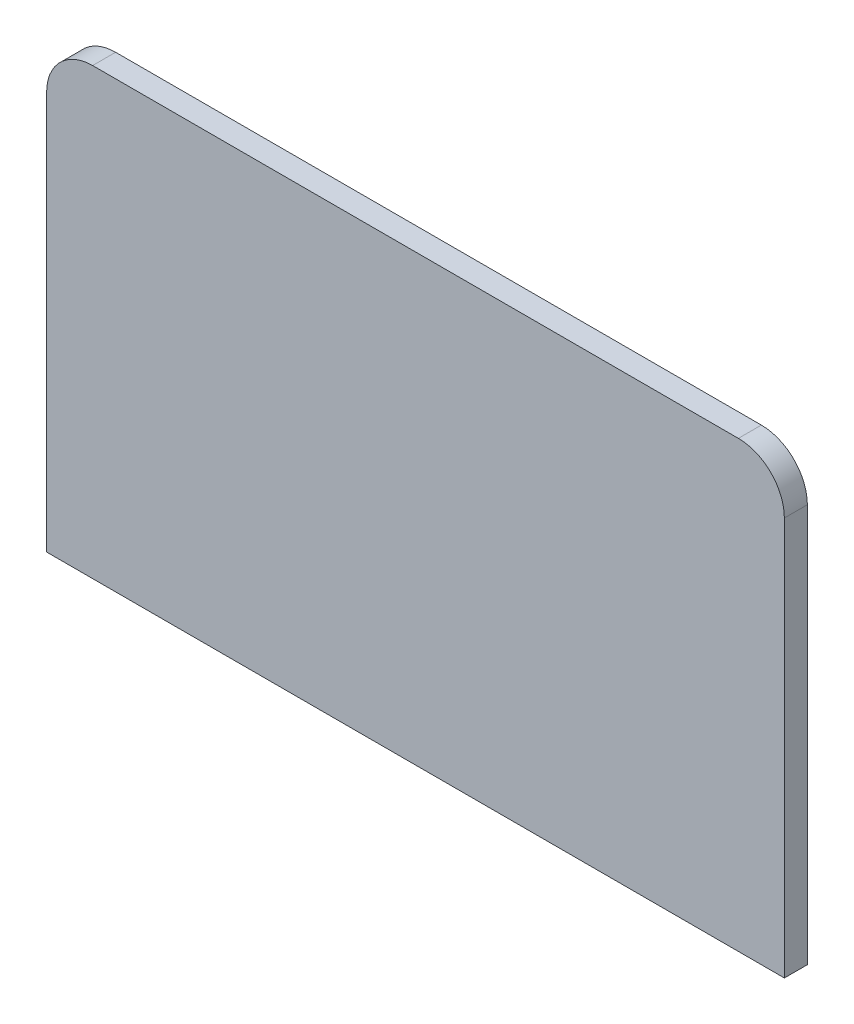
ISO-10303-21;
HEADER;
FILE_DESCRIPTION(('STEP AP214'),'2;1');
FILE_NAME('part.step','',(''),(''),'','','');
FILE_SCHEMA(('AUTOMOTIVE_DESIGN { 1 0 10303 214 1 1 1 1 }'));
ENDSEC;
DATA;
#1=APPLICATION_CONTEXT('core data for automotive mechanical design processes');
#2=APPLICATION_PROTOCOL_DEFINITION('international standard','automotive_design',2000,#1);
#3=PRODUCT_CONTEXT('',#1,'mechanical');
#4=PRODUCT('Part','Part','',(#3));
#5=PRODUCT_RELATED_PRODUCT_CATEGORY('part','',(#4));
#6=PRODUCT_DEFINITION_FORMATION('','',#4);
#7=PRODUCT_DEFINITION_CONTEXT('part definition',#1,'design');
#8=PRODUCT_DEFINITION('design','',#6,#7);
#9=PRODUCT_DEFINITION_SHAPE('','',#8);
#10=(LENGTH_UNIT() NAMED_UNIT(*) SI_UNIT(.MILLI.,.METRE.));
#11=(NAMED_UNIT(*) PLANE_ANGLE_UNIT() SI_UNIT($,.RADIAN.));
#12=(NAMED_UNIT(*) SI_UNIT($,.STERADIAN.) SOLID_ANGLE_UNIT());
#13=UNCERTAINTY_MEASURE_WITH_UNIT(LENGTH_MEASURE(1.E-05),#10,'distance_accuracy_value','');
#14=(GEOMETRIC_REPRESENTATION_CONTEXT(3) GLOBAL_UNCERTAINTY_ASSIGNED_CONTEXT((#13)) GLOBAL_UNIT_ASSIGNED_CONTEXT((#10,
#11,#12)) REPRESENTATION_CONTEXT('',''));
#15=CARTESIAN_POINT('',(0.,0.,0.));
#16=DIRECTION('',(0.,0.,1.));
#17=DIRECTION('',(1.,0.,0.));
#18=AXIS2_PLACEMENT_3D('',#15,#16,#17);
#19=CARTESIAN_POINT('',(-183.500636302133,1527.30975301925,6.35));
#20=DIRECTION('',(1.,0.,0.));
#21=DIRECTION('',(0.,0.,-1.));
#22=AXIS2_PLACEMENT_3D('',#19,#20,#21);
#23=PLANE('',#22);
#24=DIRECTION('',(0.,-1.,0.));
#25=VECTOR('',#24,1.);
#26=CARTESIAN_POINT('',(-183.500636302133,1527.30975301925,6.35));
#27=LINE('',#26,#25);
#28=CARTESIAN_POINT('',(-183.500636302133,1514.60975301925,6.35));
#29=VERTEX_POINT('',#28);
#30=CARTESIAN_POINT('',(-183.500636302133,1404.61000435069,6.35));
#31=VERTEX_POINT('',#30);
#32=EDGE_CURVE('E86',#29,#31,#27,.T.);
#33=ORIENTED_EDGE('',*,*,#32,.F.);
#34=DIRECTION('',(0.,0.,-1.));
#35=VECTOR('',#34,1.);
#36=CARTESIAN_POINT('',(-183.500636302133,1514.60975301925,6.35));
#37=LINE('',#36,#35);
#38=CARTESIAN_POINT('',(-183.500636302133,1514.60975301925,0.));
#39=VERTEX_POINT('',#38);
#40=EDGE_CURVE('E109',#29,#39,#37,.T.);
#41=ORIENTED_EDGE('',*,*,#40,.T.);
#42=DIRECTION('',(0.,-1.,0.));
#43=VECTOR('',#42,1.);
#44=CARTESIAN_POINT('',(-183.500636302133,1527.30975301925,0.));
#45=LINE('',#44,#43);
#46=CARTESIAN_POINT('',(-183.500636302133,1404.61000435069,0.));
#47=VERTEX_POINT('',#46);
#48=EDGE_CURVE('E107',#39,#47,#45,.T.);
#49=ORIENTED_EDGE('',*,*,#48,.T.);
#50=DIRECTION('',(0.,0.,-1.));
#51=VECTOR('',#50,1.);
#52=CARTESIAN_POINT('',(-183.500636302133,1404.61000435069,6.35));
#53=LINE('',#52,#51);
#54=EDGE_CURVE('E101',#31,#47,#53,.T.);
#55=ORIENTED_EDGE('',*,*,#54,.F.);
#56=EDGE_LOOP('',(#33,#41,#49,#55));
#57=FACE_BOUND('',#56,.T.);
#58=ADVANCED_FACE('F32',(#57),#23,.F.);
#59=CARTESIAN_POINT('',(-183.500636302133,1404.61000435069,6.35));
#60=DIRECTION('',(0.,1.,0.));
#61=DIRECTION('',(0.,0.,1.));
#62=AXIS2_PLACEMENT_3D('',#59,#60,#61);
#63=PLANE('',#62);
#64=DIRECTION('',(1.,0.,0.));
#65=VECTOR('',#64,1.);
#66=CARTESIAN_POINT('',(-183.500636302133,1404.61000435069,0.));
#67=LINE('',#66,#65);
#68=CARTESIAN_POINT('',(20.2073636978671,1404.61000435069,0.));
#69=VERTEX_POINT('',#68);
#70=EDGE_CURVE('E136',#47,#69,#67,.T.);
#71=ORIENTED_EDGE('',*,*,#70,.T.);
#72=DIRECTION('',(0.,0.,-1.));
#73=VECTOR('',#72,1.);
#74=CARTESIAN_POINT('',(20.2073636978671,1404.61000435069,6.35));
#75=LINE('',#74,#73);
#76=CARTESIAN_POINT('',(20.2073636978671,1404.61000435069,6.35));
#77=VERTEX_POINT('',#76);
#78=EDGE_CURVE('E103',#77,#69,#75,.T.);
#79=ORIENTED_EDGE('',*,*,#78,.F.);
#80=DIRECTION('',(1.,0.,0.));
#81=VECTOR('',#80,1.);
#82=CARTESIAN_POINT('',(-183.500636302133,1404.61000435069,6.35));
#83=LINE('',#82,#81);
#84=EDGE_CURVE('E89',#31,#77,#83,.T.);
#85=ORIENTED_EDGE('',*,*,#84,.F.);
#86=ORIENTED_EDGE('',*,*,#54,.T.);
#87=EDGE_LOOP('',(#71,#79,#85,#86));
#88=FACE_BOUND('',#87,.T.);
#89=ADVANCED_FACE('F100',(#88),#63,.F.);
#90=CARTESIAN_POINT('',(20.2073636978671,1527.30975301925,6.35));
#91=DIRECTION('',(-1.,0.,0.));
#92=DIRECTION('',(0.,0.,1.));
#93=AXIS2_PLACEMENT_3D('',#90,#91,#92);
#94=PLANE('',#93);
#95=DIRECTION('',(0.,1.,0.));
#96=VECTOR('',#95,1.);
#97=CARTESIAN_POINT('',(20.2073636978671,1527.30975301925,0.));
#98=LINE('',#97,#96);
#99=CARTESIAN_POINT('',(20.2073636978671,1514.60975301925,0.));
#100=VERTEX_POINT('',#99);
#101=EDGE_CURVE('E134',#69,#100,#98,.T.);
#102=ORIENTED_EDGE('',*,*,#101,.T.);
#103=DIRECTION('',(0.,0.,-1.));
#104=VECTOR('',#103,1.);
#105=CARTESIAN_POINT('',(20.2073636978671,1514.60975301925,6.35));
#106=LINE('',#105,#104);
#107=CARTESIAN_POINT('',(20.2073636978671,1514.60975301925,6.35));
#108=VERTEX_POINT('',#107);
#109=EDGE_CURVE('E11',#100,#108,#106,.F.);
#110=ORIENTED_EDGE('',*,*,#109,.T.);
#111=DIRECTION('',(0.,1.,0.));
#112=VECTOR('',#111,1.);
#113=CARTESIAN_POINT('',(20.2073636978671,1527.30975301925,6.35));
#114=LINE('',#113,#112);
#115=EDGE_CURVE('E104',#77,#108,#114,.T.);
#116=ORIENTED_EDGE('',*,*,#115,.F.);
#117=ORIENTED_EDGE('',*,*,#78,.T.);
#118=EDGE_LOOP('',(#102,#110,#116,#117));
#119=FACE_BOUND('',#118,.T.);
#120=ADVANCED_FACE('F135',(#119),#94,.F.);
#121=CARTESIAN_POINT('',(-183.500636302133,1527.30975301925,6.35));
#122=DIRECTION('',(0.,-1.,0.));
#123=DIRECTION('',(0.,0.,-1.));
#124=AXIS2_PLACEMENT_3D('',#121,#122,#123);
#125=PLANE('',#124);
#126=DIRECTION('',(-1.,0.,0.));
#127=VECTOR('',#126,1.);
#128=CARTESIAN_POINT('',(-183.500636302133,1527.30975301925,0.));
#129=LINE('',#128,#127);
#130=CARTESIAN_POINT('',(7.50736369786709,1527.30975301925,0.));
#131=VERTEX_POINT('',#130);
#132=CARTESIAN_POINT('',(-170.800636302133,1527.30975301925,0.));
#133=VERTEX_POINT('',#132);
#134=EDGE_CURVE('E96',#131,#133,#129,.T.);
#135=ORIENTED_EDGE('',*,*,#134,.T.);
#136=DIRECTION('',(0.,0.,-1.));
#137=VECTOR('',#136,1.);
#138=CARTESIAN_POINT('',(-170.800636302133,1527.30975301925,6.35));
#139=LINE('',#138,#137);
#140=CARTESIAN_POINT('',(-170.800636302133,1527.30975301925,6.35));
#141=VERTEX_POINT('',#140);
#142=EDGE_CURVE('E53',#133,#141,#139,.F.);
#143=ORIENTED_EDGE('',*,*,#142,.T.);
#144=DIRECTION('',(-1.,0.,0.));
#145=VECTOR('',#144,1.);
#146=CARTESIAN_POINT('',(-183.500636302133,1527.30975301925,6.35));
#147=LINE('',#146,#145);
#148=CARTESIAN_POINT('',(7.50736369786709,1527.30975301925,6.35));
#149=VERTEX_POINT('',#148);
#150=EDGE_CURVE('E113',#149,#141,#147,.T.);
#151=ORIENTED_EDGE('',*,*,#150,.F.);
#152=DIRECTION('',(0.,0.,-1.));
#153=VECTOR('',#152,1.);
#154=CARTESIAN_POINT('',(7.50736369786709,1527.30975301925,6.35));
#155=LINE('',#154,#153);
#156=EDGE_CURVE('E120',#149,#131,#155,.T.);
#157=ORIENTED_EDGE('',*,*,#156,.T.);
#158=EDGE_LOOP('',(#135,#143,#151,#157));
#159=FACE_BOUND('',#158,.T.);
#160=ADVANCED_FACE('F128',(#159),#125,.F.);
#161=CARTESIAN_POINT('',(-183.500636302133,1404.61000435069,6.35));
#162=DIRECTION('',(0.,0.,1.));
#163=DIRECTION('',(1.,0.,0.));
#164=AXIS2_PLACEMENT_3D('',#161,#162,#163);
#165=PLANE('',#164);
#166=ORIENTED_EDGE('',*,*,#150,.T.);
#167=CARTESIAN_POINT('',(-170.800636302133,1514.60975301925,6.35));
#168=DIRECTION('',(0.,0.,1.));
#169=DIRECTION('',(1.,0.,0.));
#170=AXIS2_PLACEMENT_3D('',#167,#168,#169);
#171=CIRCLE('',#170,12.7);
#172=EDGE_CURVE('E40',#141,#29,#171,.T.);
#173=ORIENTED_EDGE('',*,*,#172,.T.);
#174=ORIENTED_EDGE('',*,*,#32,.T.);
#175=ORIENTED_EDGE('',*,*,#84,.T.);
#176=ORIENTED_EDGE('',*,*,#115,.T.);
#177=CARTESIAN_POINT('',(7.50736369786709,1514.60975301925,6.35));
#178=DIRECTION('',(0.,0.,1.));
#179=DIRECTION('',(1.,0.,0.));
#180=AXIS2_PLACEMENT_3D('',#177,#178,#179);
#181=CIRCLE('',#180,12.7);
#182=EDGE_CURVE('E124',#108,#149,#181,.T.);
#183=ORIENTED_EDGE('',*,*,#182,.T.);
#184=EDGE_LOOP('',(#166,#173,#174,#175,#176,#183));
#185=FACE_BOUND('',#184,.T.);
#186=ADVANCED_FACE('F88',(#185),#165,.T.);
#187=CARTESIAN_POINT('',(-183.500636302133,1404.61000435069,0.));
#188=DIRECTION('',(0.,0.,1.));
#189=DIRECTION('',(1.,0.,0.));
#190=AXIS2_PLACEMENT_3D('',#187,#188,#189);
#191=PLANE('',#190);
#192=ORIENTED_EDGE('',*,*,#48,.F.);
#193=CARTESIAN_POINT('',(-170.800636302133,1514.60975301925,0.));
#194=DIRECTION('',(0.,0.,1.));
#195=DIRECTION('',(1.,0.,0.));
#196=AXIS2_PLACEMENT_3D('',#193,#194,#195);
#197=CIRCLE('',#196,12.7);
#198=EDGE_CURVE('E118',#39,#133,#197,.F.);
#199=ORIENTED_EDGE('',*,*,#198,.T.);
#200=ORIENTED_EDGE('',*,*,#134,.F.);
#201=CARTESIAN_POINT('',(7.50736369786709,1514.60975301925,0.));
#202=DIRECTION('',(0.,0.,1.));
#203=DIRECTION('',(1.,0.,0.));
#204=AXIS2_PLACEMENT_3D('',#201,#202,#203);
#205=CIRCLE('',#204,12.7);
#206=EDGE_CURVE('E111',#131,#100,#205,.F.);
#207=ORIENTED_EDGE('',*,*,#206,.T.);
#208=ORIENTED_EDGE('',*,*,#101,.F.);
#209=ORIENTED_EDGE('',*,*,#70,.F.);
#210=EDGE_LOOP('',(#192,#199,#200,#207,#208,#209));
#211=FACE_BOUND('',#210,.T.);
#212=ADVANCED_FACE('F133',(#211),#191,.F.);
#213=CARTESIAN_POINT('',(-170.800636302133,1514.60975301925,6.35));
#214=DIRECTION('',(0.,0.,-1.));
#215=DIRECTION('',(-1.,0.,0.));
#216=AXIS2_PLACEMENT_3D('',#213,#214,#215);
#217=CYLINDRICAL_SURFACE('',#216,12.7);
#218=ORIENTED_EDGE('',*,*,#172,.F.);
#219=ORIENTED_EDGE('',*,*,#142,.F.);
#220=ORIENTED_EDGE('',*,*,#198,.F.);
#221=ORIENTED_EDGE('',*,*,#40,.F.);
#222=EDGE_LOOP('',(#218,#219,#220,#221));
#223=FACE_BOUND('',#222,.T.);
#224=ADVANCED_FACE('F142',(#223),#217,.T.);
#225=CARTESIAN_POINT('',(7.50736369786709,1514.60975301925,6.35));
#226=DIRECTION('',(0.,0.,-1.));
#227=DIRECTION('',(-1.,0.,0.));
#228=AXIS2_PLACEMENT_3D('',#225,#226,#227);
#229=CYLINDRICAL_SURFACE('',#228,12.7);
#230=ORIENTED_EDGE('',*,*,#182,.F.);
#231=ORIENTED_EDGE('',*,*,#109,.F.);
#232=ORIENTED_EDGE('',*,*,#206,.F.);
#233=ORIENTED_EDGE('',*,*,#156,.F.);
#234=EDGE_LOOP('',(#230,#231,#232,#233));
#235=FACE_BOUND('',#234,.T.);
#236=ADVANCED_FACE('F34',(#235),#229,.T.);
#237=CLOSED_SHELL('',(#58,#89,#120,#160,#186,#212,#224,#236));
#238=MANIFOLD_SOLID_BREP('B2',#237);
#239=ADVANCED_BREP_SHAPE_REPRESENTATION('',(#18,#238),#14);
#240=SHAPE_DEFINITION_REPRESENTATION(#9,#239);
ENDSEC;
END-ISO-10303-21;
